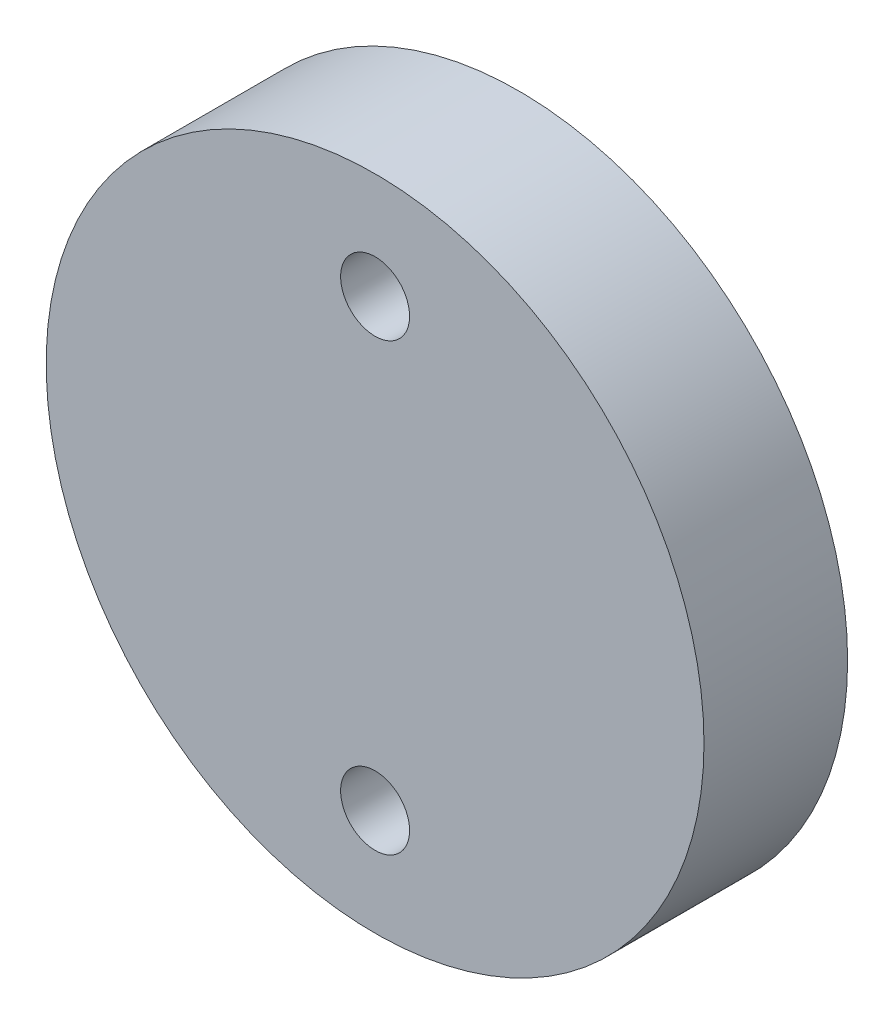
ISO-10303-21;
HEADER;
FILE_DESCRIPTION(('STEP AP214'),'2;1');
FILE_NAME('part.step','',(''),(''),'','','');
FILE_SCHEMA(('AUTOMOTIVE_DESIGN { 1 0 10303 214 1 1 1 1 }'));
ENDSEC;
DATA;
#1=APPLICATION_CONTEXT('core data for automotive mechanical design processes');
#2=APPLICATION_PROTOCOL_DEFINITION('international standard','automotive_design',2000,#1);
#3=PRODUCT_CONTEXT('',#1,'mechanical');
#4=PRODUCT('Part','Part','',(#3));
#5=PRODUCT_RELATED_PRODUCT_CATEGORY('part','',(#4));
#6=PRODUCT_DEFINITION_FORMATION('','',#4);
#7=PRODUCT_DEFINITION_CONTEXT('part definition',#1,'design');
#8=PRODUCT_DEFINITION('design','',#6,#7);
#9=PRODUCT_DEFINITION_SHAPE('','',#8);
#10=(LENGTH_UNIT() NAMED_UNIT(*) SI_UNIT(.MILLI.,.METRE.));
#11=(NAMED_UNIT(*) PLANE_ANGLE_UNIT() SI_UNIT($,.RADIAN.));
#12=(NAMED_UNIT(*) SI_UNIT($,.STERADIAN.) SOLID_ANGLE_UNIT());
#13=UNCERTAINTY_MEASURE_WITH_UNIT(LENGTH_MEASURE(1.E-05),#10,'distance_accuracy_value','');
#14=(GEOMETRIC_REPRESENTATION_CONTEXT(3) GLOBAL_UNCERTAINTY_ASSIGNED_CONTEXT((#13)) GLOBAL_UNIT_ASSIGNED_CONTEXT((#10,
#11,#12)) REPRESENTATION_CONTEXT('',''));
#15=CARTESIAN_POINT('',(0.,0.,0.));
#16=DIRECTION('',(0.,0.,1.));
#17=DIRECTION('',(1.,0.,0.));
#18=AXIS2_PLACEMENT_3D('',#15,#16,#17);
#19=CARTESIAN_POINT('',(0.,0.,5.));
#20=DIRECTION('',(0.,0.,1.));
#21=DIRECTION('',(1.,0.,0.));
#22=AXIS2_PLACEMENT_3D('',#19,#20,#21);
#23=PLANE('',#22);
#24=CARTESIAN_POINT('',(0.,7.75,5.));
#25=DIRECTION('',(0.,0.,1.));
#26=DIRECTION('',(1.,0.,0.));
#27=AXIS2_PLACEMENT_3D('',#24,#25,#26);
#28=CIRCLE('',#27,1.2);
#29=CARTESIAN_POINT('',(1.2,7.75,5.));
#30=VERTEX_POINT('',#29);
#31=EDGE_CURVE('E41',#30,#30,#28,.T.);
#32=ORIENTED_EDGE('',*,*,#31,.F.);
#33=EDGE_LOOP('',(#32));
#34=FACE_BOUND('',#33,.T.);
#35=CARTESIAN_POINT('',(0.,0.,5.));
#36=DIRECTION('',(0.,0.,1.));
#37=DIRECTION('',(1.,0.,0.));
#38=AXIS2_PLACEMENT_3D('',#35,#36,#37);
#39=CIRCLE('',#38,11.45);
#40=CARTESIAN_POINT('',(11.45,0.,5.));
#41=VERTEX_POINT('',#40);
#42=EDGE_CURVE('E10',#41,#41,#39,.T.);
#43=ORIENTED_EDGE('',*,*,#42,.T.);
#44=EDGE_LOOP('',(#43));
#45=FACE_BOUND('',#44,.T.);
#46=CARTESIAN_POINT('',(0.,-7.75,5.));
#47=DIRECTION('',(0.,0.,1.));
#48=DIRECTION('',(1.,0.,0.));
#49=AXIS2_PLACEMENT_3D('',#46,#47,#48);
#50=CIRCLE('',#49,1.2);
#51=CARTESIAN_POINT('',(1.2,-7.75,5.));
#52=VERTEX_POINT('',#51);
#53=EDGE_CURVE('E46',#52,#52,#50,.T.);
#54=ORIENTED_EDGE('',*,*,#53,.F.);
#55=EDGE_LOOP('',(#54));
#56=FACE_BOUND('',#55,.T.);
#57=ADVANCED_FACE('F30',(#34,#45,#56),#23,.T.);
#58=CARTESIAN_POINT('',(0.,0.,0.));
#59=DIRECTION('',(0.,0.,1.));
#60=DIRECTION('',(1.,0.,0.));
#61=AXIS2_PLACEMENT_3D('',#58,#59,#60);
#62=PLANE('',#61);
#63=CARTESIAN_POINT('',(0.,0.,0.));
#64=DIRECTION('',(0.,0.,1.));
#65=DIRECTION('',(1.,0.,0.));
#66=AXIS2_PLACEMENT_3D('',#63,#64,#65);
#67=CIRCLE('',#66,11.45);
#68=CARTESIAN_POINT('',(11.45,0.,0.));
#69=VERTEX_POINT('',#68);
#70=EDGE_CURVE('E34',#69,#69,#67,.T.);
#71=ORIENTED_EDGE('',*,*,#70,.F.);
#72=EDGE_LOOP('',(#71));
#73=FACE_BOUND('',#72,.T.);
#74=CARTESIAN_POINT('',(0.,7.75,0.));
#75=DIRECTION('',(0.,0.,1.));
#76=DIRECTION('',(1.,0.,0.));
#77=AXIS2_PLACEMENT_3D('',#74,#75,#76);
#78=CIRCLE('',#77,1.2);
#79=CARTESIAN_POINT('',(1.2,7.75,0.));
#80=VERTEX_POINT('',#79);
#81=EDGE_CURVE('E43',#80,#80,#78,.T.);
#82=ORIENTED_EDGE('',*,*,#81,.T.);
#83=EDGE_LOOP('',(#82));
#84=FACE_BOUND('',#83,.T.);
#85=CARTESIAN_POINT('',(0.,-7.75,0.));
#86=DIRECTION('',(0.,0.,1.));
#87=DIRECTION('',(1.,0.,0.));
#88=AXIS2_PLACEMENT_3D('',#85,#86,#87);
#89=CIRCLE('',#88,1.2);
#90=CARTESIAN_POINT('',(1.2,-7.75,0.));
#91=VERTEX_POINT('',#90);
#92=EDGE_CURVE('E49',#91,#91,#89,.T.);
#93=ORIENTED_EDGE('',*,*,#92,.T.);
#94=EDGE_LOOP('',(#93));
#95=FACE_BOUND('',#94,.T.);
#96=ADVANCED_FACE('F59',(#73,#84,#95),#62,.F.);
#97=CARTESIAN_POINT('',(0.,0.,5.));
#98=DIRECTION('',(0.,0.,-1.));
#99=DIRECTION('',(-1.,0.,0.));
#100=AXIS2_PLACEMENT_3D('',#97,#98,#99);
#101=CYLINDRICAL_SURFACE('',#100,11.45);
#102=ORIENTED_EDGE('',*,*,#42,.F.);
#103=EDGE_LOOP('',(#102));
#104=FACE_BOUND('',#103,.T.);
#105=ORIENTED_EDGE('',*,*,#70,.T.);
#106=EDGE_LOOP('',(#105));
#107=FACE_BOUND('',#106,.T.);
#108=ADVANCED_FACE('F32',(#104,#107),#101,.T.);
#109=CARTESIAN_POINT('',(0.,7.75,5.));
#110=DIRECTION('',(0.,0.,-1.));
#111=DIRECTION('',(-1.,0.,0.));
#112=AXIS2_PLACEMENT_3D('',#109,#110,#111);
#113=CYLINDRICAL_SURFACE('',#112,1.2);
#114=ORIENTED_EDGE('',*,*,#31,.T.);
#115=EDGE_LOOP('',(#114));
#116=FACE_BOUND('',#115,.T.);
#117=ORIENTED_EDGE('',*,*,#81,.F.);
#118=EDGE_LOOP('',(#117));
#119=FACE_BOUND('',#118,.T.);
#120=ADVANCED_FACE('F68',(#116,#119),#113,.F.);
#121=CARTESIAN_POINT('',(0.,-7.75,5.));
#122=DIRECTION('',(0.,0.,-1.));
#123=DIRECTION('',(-1.,0.,0.));
#124=AXIS2_PLACEMENT_3D('',#121,#122,#123);
#125=CYLINDRICAL_SURFACE('',#124,1.2);
#126=ORIENTED_EDGE('',*,*,#53,.T.);
#127=EDGE_LOOP('',(#126));
#128=FACE_BOUND('',#127,.T.);
#129=ORIENTED_EDGE('',*,*,#92,.F.);
#130=EDGE_LOOP('',(#129));
#131=FACE_BOUND('',#130,.T.);
#132=ADVANCED_FACE('F55',(#128,#131),#125,.F.);
#133=CLOSED_SHELL('',(#57,#96,#108,#120,#132));
#134=MANIFOLD_SOLID_BREP('B2',#133);
#135=ADVANCED_BREP_SHAPE_REPRESENTATION('',(#18,#134),#14);
#136=SHAPE_DEFINITION_REPRESENTATION(#9,#135);
ENDSEC;
END-ISO-10303-21;
